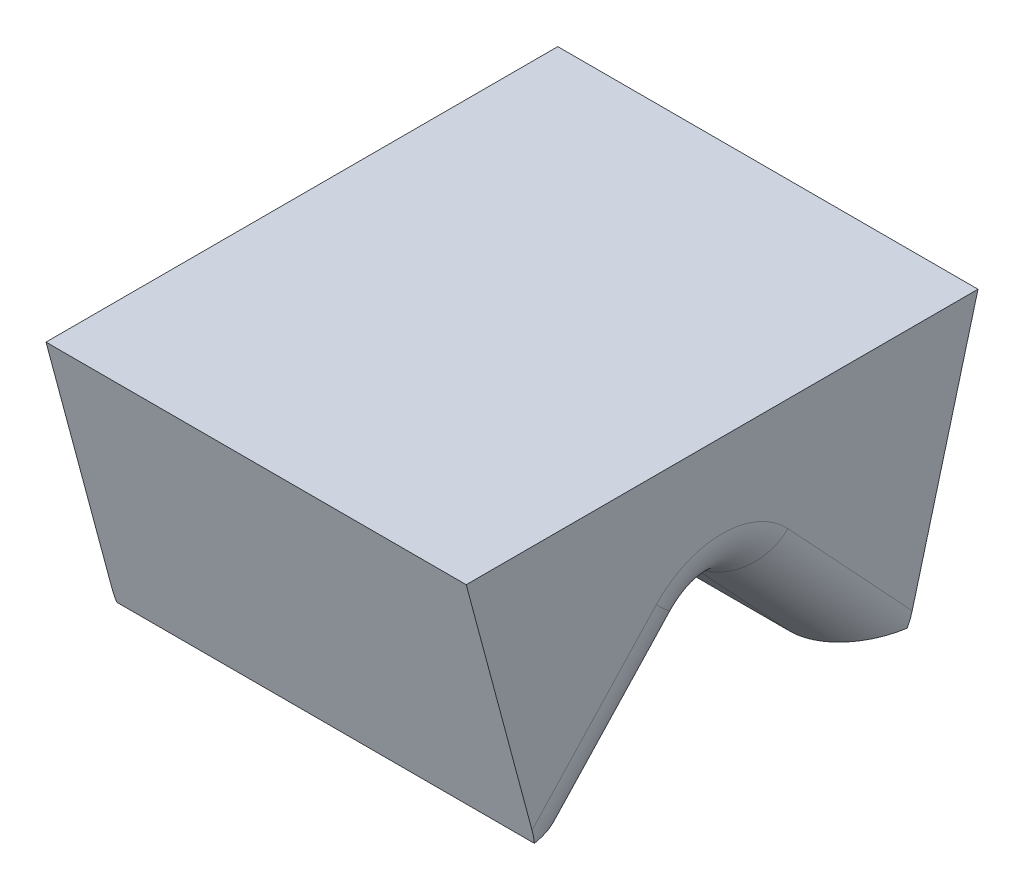
ISO-10303-21;
HEADER;
FILE_DESCRIPTION(('STEP AP214'),'2;1');
FILE_NAME('part.step','',(''),(''),'','','');
FILE_SCHEMA(('AUTOMOTIVE_DESIGN { 1 0 10303 214 1 1 1 1 }'));
ENDSEC;
DATA;
#1=APPLICATION_CONTEXT('core data for automotive mechanical design processes');
#2=APPLICATION_PROTOCOL_DEFINITION('international standard','automotive_design',2000,#1);
#3=PRODUCT_CONTEXT('',#1,'mechanical');
#4=PRODUCT('Part','Part','',(#3));
#5=PRODUCT_RELATED_PRODUCT_CATEGORY('part','',(#4));
#6=PRODUCT_DEFINITION_FORMATION('','',#4);
#7=PRODUCT_DEFINITION_CONTEXT('part definition',#1,'design');
#8=PRODUCT_DEFINITION('design','',#6,#7);
#9=PRODUCT_DEFINITION_SHAPE('','',#8);
#10=(LENGTH_UNIT() NAMED_UNIT(*) SI_UNIT(.MILLI.,.METRE.));
#11=(NAMED_UNIT(*) PLANE_ANGLE_UNIT() SI_UNIT($,.RADIAN.));
#12=(NAMED_UNIT(*) SI_UNIT($,.STERADIAN.) SOLID_ANGLE_UNIT());
#13=UNCERTAINTY_MEASURE_WITH_UNIT(LENGTH_MEASURE(1.E-05),#10,'distance_accuracy_value','');
#14=(GEOMETRIC_REPRESENTATION_CONTEXT(3) GLOBAL_UNCERTAINTY_ASSIGNED_CONTEXT((#13)) GLOBAL_UNIT_ASSIGNED_CONTEXT((#10,
#11,#12)) REPRESENTATION_CONTEXT('',''));
#15=CARTESIAN_POINT('',(0.,0.,0.));
#16=DIRECTION('',(0.,0.,1.));
#17=DIRECTION('',(1.,0.,0.));
#18=AXIS2_PLACEMENT_3D('',#15,#16,#17);
#19=CARTESIAN_POINT('',(0.,0.277595628415304,0.));
#20=DIRECTION('',(0.,1.,0.));
#21=DIRECTION('',(0.,0.,1.));
#22=AXIS2_PLACEMENT_3D('',#19,#20,#21);
#23=PLANE('',#22);
#24=DIRECTION('',(0.,0.,-1.));
#25=VECTOR('',#24,1.);
#26=CARTESIAN_POINT('',(-0.22606,0.277595628415304,1.50859998));
#27=LINE('',#26,#25);
#28=CARTESIAN_POINT('',(-0.22606,0.277595628415304,0.273771524456291));
#29=VERTEX_POINT('',#28);
#30=CARTESIAN_POINT('',(-0.22606,0.277595628415304,-0.273771524456291));
#31=VERTEX_POINT('',#30);
#32=EDGE_CURVE('E142',#29,#31,#27,.T.);
#33=ORIENTED_EDGE('',*,*,#32,.F.);
#34=DIRECTION('',(-1.,0.,0.));
#35=VECTOR('',#34,1.);
#36=CARTESIAN_POINT('',(1.50859998,0.277595628415304,0.273771524456291));
#37=LINE('',#36,#35);
#38=CARTESIAN_POINT('',(0.22352,0.277595628415304,0.273771524456291));
#39=VERTEX_POINT('',#38);
#40=EDGE_CURVE('E57',#39,#29,#37,.T.);
#41=ORIENTED_EDGE('',*,*,#40,.F.);
#42=DIRECTION('',(0.,0.,1.));
#43=VECTOR('',#42,1.);
#44=CARTESIAN_POINT('',(0.22352,0.277595628415304,1.50859998));
#45=LINE('',#44,#43);
#46=CARTESIAN_POINT('',(0.22352,0.277595628415304,-0.273771524456291));
#47=VERTEX_POINT('',#46);
#48=EDGE_CURVE('E12',#47,#39,#45,.T.);
#49=ORIENTED_EDGE('',*,*,#48,.F.);
#50=DIRECTION('',(1.,0.,0.));
#51=VECTOR('',#50,1.);
#52=CARTESIAN_POINT('',(1.50859998,0.277595628415304,-0.273771524456291));
#53=LINE('',#52,#51);
#54=EDGE_CURVE('E129',#31,#47,#53,.T.);
#55=ORIENTED_EDGE('',*,*,#54,.F.);
#56=EDGE_LOOP('',(#33,#41,#49,#55));
#57=FACE_BOUND('',#56,.T.);
#58=ADVANCED_FACE('F42',(#57),#23,.T.);
#59=CARTESIAN_POINT('',(1.50859998,0.,-0.19939));
#60=DIRECTION('',(0.,-0.258819045102522,-0.965925826289068));
#61=DIRECTION('',(0.,0.965925826289068,-0.258819045102522));
#62=AXIS2_PLACEMENT_3D('',#59,#60,#61);
#63=PLANE('',#62);
#64=DIRECTION('',(0.,0.965925826289068,-0.258819045102522));
#65=VECTOR('',#64,1.);
#66=CARTESIAN_POINT('',(-0.22606,0.,-0.19939));
#67=LINE('',#66,#65);
#68=CARTESIAN_POINT('',(-0.22606,0.0148722676221145,-0.203375012098965));
#69=VERTEX_POINT('',#68);
#70=EDGE_CURVE('E141',#69,#31,#67,.T.);
#71=ORIENTED_EDGE('',*,*,#70,.T.);
#72=ORIENTED_EDGE('',*,*,#54,.T.);
#73=DIRECTION('',(0.,-0.965925826289068,0.258819045102522));
#74=VECTOR('',#73,1.);
#75=CARTESIAN_POINT('',(0.22352,0.,-0.19939));
#76=LINE('',#75,#74);
#77=CARTESIAN_POINT('',(0.22352,0.0148722676221145,-0.203375012098965));
#78=VERTEX_POINT('',#77);
#79=EDGE_CURVE('E138',#47,#78,#76,.T.);
#80=ORIENTED_EDGE('',*,*,#79,.T.);
#81=CARTESIAN_POINT('',(0.16256,0.0148722676221145,-0.203375012098965));
#82=DIRECTION('',(0.,-0.258819045102522,-0.965925826289068));
#83=DIRECTION('',(0.,-0.965925826289068,0.258819045102522));
#84=AXIS2_PLACEMENT_3D('',#81,#82,#83);
#85=ELLIPSE('',#84,0.0718827154689534,0.06096);
#86=CARTESIAN_POINT('',(0.222105177071707,0.,-0.19939));
#87=VERTEX_POINT('',#86);
#88=EDGE_CURVE('E251',#78,#87,#85,.T.);
#89=ORIENTED_EDGE('',*,*,#88,.T.);
#90=DIRECTION('',(-1.,0.,0.));
#91=VECTOR('',#90,1.);
#92=CARTESIAN_POINT('',(1.50859998,0.,-0.19939));
#93=LINE('',#92,#91);
#94=CARTESIAN_POINT('',(-0.224645177071708,0.,-0.19939));
#95=VERTEX_POINT('',#94);
#96=EDGE_CURVE('E157',#87,#95,#93,.T.);
#97=ORIENTED_EDGE('',*,*,#96,.T.);
#98=CARTESIAN_POINT('',(-0.1651,0.0148722676221145,-0.203375012098965));
#99=DIRECTION('',(0.,-0.258819045102522,-0.965925826289068));
#100=DIRECTION('',(0.,0.965925826289068,-0.258819045102522));
#101=AXIS2_PLACEMENT_3D('',#98,#99,#100);
#102=ELLIPSE('',#101,0.0718827154689534,0.06096);
#103=EDGE_CURVE('E285',#95,#69,#102,.T.);
#104=ORIENTED_EDGE('',*,*,#103,.T.);
#105=EDGE_LOOP('',(#71,#72,#80,#89,#97,#104));
#106=FACE_BOUND('',#105,.T.);
#107=ADVANCED_FACE('F137',(#106),#63,.T.);
#108=CARTESIAN_POINT('',(1.50859998,0.,0.19939));
#109=DIRECTION('',(0.,-0.258819045102522,0.965925826289068));
#110=DIRECTION('',(0.,-0.965925826289068,-0.258819045102522));
#111=AXIS2_PLACEMENT_3D('',#108,#109,#110);
#112=PLANE('',#111);
#113=DIRECTION('',(0.,0.965925826289068,0.258819045102522));
#114=VECTOR('',#113,1.);
#115=CARTESIAN_POINT('',(0.22352,0.,0.19939));
#116=LINE('',#115,#114);
#117=CARTESIAN_POINT('',(0.22352,0.0148722676221144,0.203375012098965));
#118=VERTEX_POINT('',#117);
#119=EDGE_CURVE('E148',#118,#39,#116,.T.);
#120=ORIENTED_EDGE('',*,*,#119,.T.);
#121=ORIENTED_EDGE('',*,*,#40,.T.);
#122=DIRECTION('',(0.,-0.965925826289068,-0.258819045102522));
#123=VECTOR('',#122,1.);
#124=CARTESIAN_POINT('',(-0.22606,0.,0.19939));
#125=LINE('',#124,#123);
#126=CARTESIAN_POINT('',(-0.22606,0.0148722676221144,0.203375012098965));
#127=VERTEX_POINT('',#126);
#128=EDGE_CURVE('E160',#29,#127,#125,.T.);
#129=ORIENTED_EDGE('',*,*,#128,.T.);
#130=CARTESIAN_POINT('',(-0.1651,0.0148722676221144,0.203375012098965));
#131=DIRECTION('',(0.,-0.258819045102522,0.965925826289068));
#132=DIRECTION('',(0.,-0.965925826289068,-0.258819045102522));
#133=AXIS2_PLACEMENT_3D('',#130,#131,#132);
#134=ELLIPSE('',#133,0.0718827154689534,0.06096);
#135=CARTESIAN_POINT('',(-0.224645177071708,0.,0.19939));
#136=VERTEX_POINT('',#135);
#137=EDGE_CURVE('E64',#127,#136,#134,.T.);
#138=ORIENTED_EDGE('',*,*,#137,.T.);
#139=DIRECTION('',(-1.,0.,0.));
#140=VECTOR('',#139,1.);
#141=CARTESIAN_POINT('',(1.50859998,0.,0.19939));
#142=LINE('',#141,#140);
#143=CARTESIAN_POINT('',(0.222105177071707,0.,0.19939));
#144=VERTEX_POINT('',#143);
#145=EDGE_CURVE('E150',#144,#136,#142,.T.);
#146=ORIENTED_EDGE('',*,*,#145,.F.);
#147=CARTESIAN_POINT('',(0.16256,0.0148722676221144,0.203375012098965));
#148=DIRECTION('',(0.,-0.258819045102522,0.965925826289068));
#149=DIRECTION('',(0.,0.965925826289068,0.258819045102522));
#150=AXIS2_PLACEMENT_3D('',#147,#148,#149);
#151=ELLIPSE('',#150,0.0718827154689534,0.06096);
#152=EDGE_CURVE('E267',#144,#118,#151,.T.);
#153=ORIENTED_EDGE('',*,*,#152,.T.);
#154=EDGE_LOOP('',(#120,#121,#129,#138,#146,#153));
#155=FACE_BOUND('',#154,.T.);
#156=ADVANCED_FACE('F215',(#155),#112,.T.);
#157=CARTESIAN_POINT('',(-0.22606,0.79010002,1.50859998));
#158=DIRECTION('',(-1.,0.,0.));
#159=DIRECTION('',(0.,-1.,0.));
#160=AXIS2_PLACEMENT_3D('',#157,#158,#159);
#161=PLANE('',#160);
#162=ORIENTED_EDGE('',*,*,#128,.F.);
#163=ORIENTED_EDGE('',*,*,#32,.T.);
#164=ORIENTED_EDGE('',*,*,#70,.F.);
#165=DIRECTION('',(0.,-0.731353701619171,-0.681998360062498));
#166=VECTOR('',#165,1.);
#167=CARTESIAN_POINT('',(-0.22606,0.157266481713232,-0.0705902592802821));
#168=LINE('',#167,#166);
#169=CARTESIAN_POINT('',(-0.22606,0.157266481713232,-0.0705902592802823));
#170=VERTEX_POINT('',#169);
#171=EDGE_CURVE('E294',#69,#170,#168,.F.);
#172=ORIENTED_EDGE('',*,*,#171,.T.);
#173=CARTESIAN_POINT('',(-0.22606,0.0914399999999999,0.));
#174=DIRECTION('',(-1.,0.,0.));
#175=DIRECTION('',(0.,-1.,0.));
#176=AXIS2_PLACEMENT_3D('',#173,#174,#175);
#177=CIRCLE('',#176,0.0965199999999998);
#178=CARTESIAN_POINT('',(-0.22606,0.157266481713232,0.0705902592802822));
#179=VERTEX_POINT('',#178);
#180=EDGE_CURVE('E292',#170,#179,#177,.F.);
#181=ORIENTED_EDGE('',*,*,#180,.T.);
#182=DIRECTION('',(0.,0.731353701619172,-0.681998360062497));
#183=VECTOR('',#182,1.);
#184=CARTESIAN_POINT('',(-0.22606,0.0415746200294097,0.178474665643798));
#185=LINE('',#184,#183);
#186=EDGE_CURVE('E289',#179,#127,#185,.F.);
#187=ORIENTED_EDGE('',*,*,#186,.T.);
#188=EDGE_LOOP('',(#162,#163,#164,#172,#181,#187));
#189=FACE_BOUND('',#188,.T.);
#190=ADVANCED_FACE('F320',(#189),#161,.T.);
#191=CARTESIAN_POINT('',(0.22352,-0.00999998,1.50859998));
#192=DIRECTION('',(1.,0.,0.));
#193=DIRECTION('',(0.,1.,0.));
#194=AXIS2_PLACEMENT_3D('',#191,#192,#193);
#195=PLANE('',#194);
#196=ORIENTED_EDGE('',*,*,#79,.F.);
#197=ORIENTED_EDGE('',*,*,#48,.T.);
#198=ORIENTED_EDGE('',*,*,#119,.F.);
#199=DIRECTION('',(0.,-0.731353701619172,0.681998360062497));
#200=VECTOR('',#199,1.);
#201=CARTESIAN_POINT('',(0.22352,0.157266481713232,0.0705902592802824));
#202=LINE('',#201,#200);
#203=CARTESIAN_POINT('',(0.22352,0.157266481713232,0.0705902592802822));
#204=VERTEX_POINT('',#203);
#205=EDGE_CURVE('E244',#118,#204,#202,.F.);
#206=ORIENTED_EDGE('',*,*,#205,.T.);
#207=CARTESIAN_POINT('',(0.22352,0.0914399999999999,0.));
#208=DIRECTION('',(1.,0.,0.));
#209=DIRECTION('',(0.,1.,0.));
#210=AXIS2_PLACEMENT_3D('',#207,#208,#209);
#211=CIRCLE('',#210,0.0965199999999998);
#212=CARTESIAN_POINT('',(0.22352,0.157266481713232,-0.0705902592802823));
#213=VERTEX_POINT('',#212);
#214=EDGE_CURVE('E248',#204,#213,#211,.F.);
#215=ORIENTED_EDGE('',*,*,#214,.T.);
#216=DIRECTION('',(0.,0.731353701619171,0.681998360062498));
#217=VECTOR('',#216,1.);
#218=CARTESIAN_POINT('',(0.22352,0.0415746200294098,-0.178474665643798));
#219=LINE('',#218,#217);
#220=EDGE_CURVE('E146',#213,#78,#219,.F.);
#221=ORIENTED_EDGE('',*,*,#220,.T.);
#222=EDGE_LOOP('',(#196,#197,#198,#206,#215,#221));
#223=FACE_BOUND('',#222,.T.);
#224=ADVANCED_FACE('F144',(#223),#195,.T.);
#225=CARTESIAN_POINT('',(0.,0.,0.));
#226=DIRECTION('',(0.,1.,0.));
#227=DIRECTION('',(0.,0.,1.));
#228=AXIS2_PLACEMENT_3D('',#225,#226,#227);
#229=PLANE('',#228);
#230=CARTESIAN_POINT('',(0.16256,0.,-0.133891343993093));
#231=DIRECTION('',(-1.,0.,0.));
#232=VECTOR('',#231,1.);
#233=LINE('',#230,#232);
#234=CARTESIAN_POINT('',(0.16256,0.,-0.133891343993093));
#235=VERTEX_POINT('',#234);
#236=CARTESIAN_POINT('',(-0.1651,0.,-0.133891343993093));
#237=VERTEX_POINT('',#236);
#238=EDGE_CURVE('E240',#235,#237,#233,.T.);
#239=ORIENTED_EDGE('',*,*,#238,.T.);
#240=CARTESIAN_POINT('',(-0.1651,0.,-0.217243626021663));
#241=DIRECTION('',(0.,1.,0.));
#242=DIRECTION('',(0.,0.,1.));
#243=AXIS2_PLACEMENT_3D('',#240,#241,#242);
#244=ELLIPSE('',#243,0.0833522820285703,0.06096);
#245=EDGE_CURVE('E281',#237,#95,#244,.F.);
#246=ORIENTED_EDGE('',*,*,#245,.T.);
#247=ORIENTED_EDGE('',*,*,#96,.F.);
#248=CARTESIAN_POINT('',(0.16256,0.,-0.217243626021663));
#249=DIRECTION('',(0.,1.,0.));
#250=DIRECTION('',(0.,0.,-1.));
#251=AXIS2_PLACEMENT_3D('',#248,#249,#250);
#252=ELLIPSE('',#251,0.0833522820285703,0.06096);
#253=EDGE_CURVE('E253',#87,#235,#252,.F.);
#254=ORIENTED_EDGE('',*,*,#253,.T.);
#255=EDGE_LOOP('',(#239,#246,#247,#254));
#256=FACE_BOUND('',#255,.T.);
#257=ADVANCED_FACE('F182',(#256),#229,.F.);
#258=ORIENTED_EDGE('',*,*,#145,.T.);
#259=CARTESIAN_POINT('',(-0.1651,0.,0.217243626021663));
#260=DIRECTION('',(0.,1.,0.));
#261=DIRECTION('',(0.,0.,1.));
#262=AXIS2_PLACEMENT_3D('',#259,#260,#261);
#263=ELLIPSE('',#262,0.0833522820285702,0.06096);
#264=CARTESIAN_POINT('',(-0.1651,0.,0.133891343993093));
#265=VERTEX_POINT('',#264);
#266=EDGE_CURVE('E50',#136,#265,#263,.F.);
#267=ORIENTED_EDGE('',*,*,#266,.T.);
#268=CARTESIAN_POINT('',(-0.1651,0.,0.133891343993093));
#269=DIRECTION('',(1.,0.,0.));
#270=VECTOR('',#269,1.);
#271=LINE('',#268,#270);
#272=CARTESIAN_POINT('',(0.16256,0.,0.133891343993093));
#273=VERTEX_POINT('',#272);
#274=EDGE_CURVE('E162',#265,#273,#271,.T.);
#275=ORIENTED_EDGE('',*,*,#274,.T.);
#276=CARTESIAN_POINT('',(0.16256,0.,0.217243626021663));
#277=DIRECTION('',(0.,1.,0.));
#278=DIRECTION('',(0.,0.,-1.));
#279=AXIS2_PLACEMENT_3D('',#276,#277,#278);
#280=ELLIPSE('',#279,0.0833522820285702,0.06096);
#281=EDGE_CURVE('E263',#273,#144,#280,.F.);
#282=ORIENTED_EDGE('',*,*,#281,.T.);
#283=EDGE_LOOP('',(#258,#267,#275,#282));
#284=FACE_BOUND('',#283,.T.);
#285=ADVANCED_FACE('F171',(#284),#229,.F.);
#286=CARTESIAN_POINT('',(-1.20142,0.115691861683822,-0.0260069376295776));
#287=DIRECTION('',(0.,0.681998360062498,-0.731353701619171));
#288=DIRECTION('',(0.,0.731353701619171,0.681998360062498));
#289=AXIS2_PLACEMENT_3D('',#286,#287,#288);
#290=PLANE('',#289);
#291=DIRECTION('',(1.,0.,0.));
#292=VECTOR('',#291,1.);
#293=CARTESIAN_POINT('',(-1.20142,0.115691861683822,-0.0260069376295776));
#294=LINE('',#293,#292);
#295=CARTESIAN_POINT('',(-0.1651,0.115691861683822,-0.0260069376295776));
#296=VERTEX_POINT('',#295);
#297=CARTESIAN_POINT('',(0.16256,0.115691861683822,-0.0260069376295776));
#298=VERTEX_POINT('',#297);
#299=EDGE_CURVE('E279',#296,#298,#294,.T.);
#300=ORIENTED_EDGE('',*,*,#299,.F.);
#301=DIRECTION('',(0.,-0.731353701619171,-0.681998360062498));
#302=VECTOR('',#301,1.);
#303=CARTESIAN_POINT('',(-0.1651,0.,-0.133891343993093));
#304=LINE('',#303,#302);
#305=EDGE_CURVE('E271',#296,#237,#304,.T.);
#306=ORIENTED_EDGE('',*,*,#305,.T.);
#307=ORIENTED_EDGE('',*,*,#238,.F.);
#308=DIRECTION('',(0.,0.731353701619171,0.681998360062498));
#309=VECTOR('',#308,1.);
#310=CARTESIAN_POINT('',(0.16256,0.115691861683822,-0.0260069376295776));
#311=LINE('',#310,#309);
#312=EDGE_CURVE('E242',#235,#298,#311,.T.);
#313=ORIENTED_EDGE('',*,*,#312,.T.);
#314=EDGE_LOOP('',(#300,#306,#307,#313));
#315=FACE_BOUND('',#314,.T.);
#316=ADVANCED_FACE('F181',(#315),#290,.F.);
#317=CARTESIAN_POINT('',(-1.20142,-0.00999998000000011,0.143216476204168));
#318=DIRECTION('',(0.,0.681998360062497,0.731353701619172));
#319=DIRECTION('',(0.,-0.731353701619172,0.681998360062497));
#320=AXIS2_PLACEMENT_3D('',#317,#318,#319);
#321=PLANE('',#320);
#322=ORIENTED_EDGE('',*,*,#274,.F.);
#323=DIRECTION('',(0.,0.731353701619172,-0.681998360062497));
#324=VECTOR('',#323,1.);
#325=CARTESIAN_POINT('',(-0.1651,0.115691861683822,0.0260069376295777));
#326=LINE('',#325,#324);
#327=CARTESIAN_POINT('',(-0.1651,0.115691861683822,0.0260069376295776));
#328=VERTEX_POINT('',#327);
#329=EDGE_CURVE('E297',#265,#328,#326,.T.);
#330=ORIENTED_EDGE('',*,*,#329,.T.);
#331=DIRECTION('',(1.,0.,0.));
#332=VECTOR('',#331,1.);
#333=CARTESIAN_POINT('',(-1.20142,0.115691861683822,0.0260069376295776));
#334=LINE('',#333,#332);
#335=CARTESIAN_POINT('',(0.16256,0.115691861683822,0.0260069376295776));
#336=VERTEX_POINT('',#335);
#337=EDGE_CURVE('E152',#328,#336,#334,.T.);
#338=ORIENTED_EDGE('',*,*,#337,.T.);
#339=DIRECTION('',(0.,-0.731353701619172,0.681998360062497));
#340=VECTOR('',#339,1.);
#341=CARTESIAN_POINT('',(0.16256,0.,0.133891343993093));
#342=LINE('',#341,#340);
#343=EDGE_CURVE('E260',#336,#273,#342,.T.);
#344=ORIENTED_EDGE('',*,*,#343,.T.);
#345=EDGE_LOOP('',(#322,#330,#338,#344));
#346=FACE_BOUND('',#345,.T.);
#347=ADVANCED_FACE('F220',(#346),#321,.F.);
#348=CARTESIAN_POINT('',(-1.20142,0.0914399999999999,0.));
#349=DIRECTION('',(1.,0.,0.));
#350=DIRECTION('',(0.,0.,-1.));
#351=AXIS2_PLACEMENT_3D('',#348,#349,#350);
#352=CYLINDRICAL_SURFACE('',#351,0.0355599999999998);
#353=ORIENTED_EDGE('',*,*,#337,.F.);
#354=CARTESIAN_POINT('',(-0.1651,0.0914399999999999,0.));
#355=DIRECTION('',(-1.,0.,0.));
#356=DIRECTION('',(0.,-1.,0.));
#357=AXIS2_PLACEMENT_3D('',#354,#355,#356);
#358=CIRCLE('',#357,0.0355599999999998);
#359=EDGE_CURVE('E296',#328,#296,#358,.T.);
#360=ORIENTED_EDGE('',*,*,#359,.T.);
#361=ORIENTED_EDGE('',*,*,#299,.T.);
#362=CARTESIAN_POINT('',(0.16256,0.0914399999999999,0.));
#363=DIRECTION('',(1.,0.,0.));
#364=DIRECTION('',(0.,1.,0.));
#365=AXIS2_PLACEMENT_3D('',#362,#363,#364);
#366=CIRCLE('',#365,0.0355599999999998);
#367=EDGE_CURVE('E255',#298,#336,#366,.T.);
#368=ORIENTED_EDGE('',*,*,#367,.T.);
#369=EDGE_LOOP('',(#353,#360,#361,#368));
#370=FACE_BOUND('',#369,.T.);
#371=ADVANCED_FACE('F197',(#370),#352,.F.);
#372=CARTESIAN_POINT('',(0.16256,0.0315746400294098,0.187799797854873));
#373=DIRECTION('',(0.,0.731353701619172,-0.681998360062497));
#374=DIRECTION('',(0.,0.681998360062497,0.731353701619172));
#375=AXIS2_PLACEMENT_3D('',#372,#373,#374);
#376=CYLINDRICAL_SURFACE('',#375,0.06096);
#377=ORIENTED_EDGE('',*,*,#281,.F.);
#378=ORIENTED_EDGE('',*,*,#343,.F.);
#379=CARTESIAN_POINT('',(0.16256,0.157266481713232,0.0705902592802822));
#380=DIRECTION('',(0.,0.731353701619171,-0.681998360062498));
#381=DIRECTION('',(0.,0.681998360062498,0.731353701619171));
#382=AXIS2_PLACEMENT_3D('',#379,#380,#381);
#383=CIRCLE('',#382,0.06096);
#384=EDGE_CURVE('E275',#204,#336,#383,.T.);
#385=ORIENTED_EDGE('',*,*,#384,.F.);
#386=ORIENTED_EDGE('',*,*,#205,.F.);
#387=ORIENTED_EDGE('',*,*,#152,.F.);
#388=EDGE_LOOP('',(#377,#378,#385,#386,#387));
#389=FACE_BOUND('',#388,.T.);
#390=ADVANCED_FACE('F193',(#389),#376,.T.);
#391=CARTESIAN_POINT('',(0.16256,0.0914399999999999,0.));
#392=DIRECTION('',(1.,0.,0.));
#393=DIRECTION('',(0.,1.,0.));
#394=AXIS2_PLACEMENT_3D('',#391,#392,#393);
#395=TOROIDAL_SURFACE('',#394,0.0965199999999998,0.06096);
#396=ORIENTED_EDGE('',*,*,#384,.T.);
#397=ORIENTED_EDGE('',*,*,#367,.F.);
#398=CARTESIAN_POINT('',(0.16256,0.157266481713232,-0.0705902592802823));
#399=DIRECTION('',(0.,-0.731353701619171,-0.681998360062498));
#400=DIRECTION('',(0.,0.681998360062498,-0.731353701619171));
#401=AXIS2_PLACEMENT_3D('',#398,#399,#400);
#402=CIRCLE('',#401,0.06096);
#403=EDGE_CURVE('E272',#213,#298,#402,.T.);
#404=ORIENTED_EDGE('',*,*,#403,.F.);
#405=ORIENTED_EDGE('',*,*,#214,.F.);
#406=EDGE_LOOP('',(#396,#397,#404,#405));
#407=FACE_BOUND('',#406,.T.);
#408=ADVANCED_FACE('F189',(#407),#395,.T.);
#409=CARTESIAN_POINT('',(0.16256,0.157266481713232,-0.0705902592802822));
#410=DIRECTION('',(0.,-0.731353701619171,-0.681998360062498));
#411=DIRECTION('',(0.,0.681998360062498,-0.731353701619171));
#412=AXIS2_PLACEMENT_3D('',#409,#410,#411);
#413=CYLINDRICAL_SURFACE('',#412,0.06096);
#414=ORIENTED_EDGE('',*,*,#88,.F.);
#415=ORIENTED_EDGE('',*,*,#220,.F.);
#416=ORIENTED_EDGE('',*,*,#403,.T.);
#417=ORIENTED_EDGE('',*,*,#312,.F.);
#418=ORIENTED_EDGE('',*,*,#253,.F.);
#419=EDGE_LOOP('',(#414,#415,#416,#417,#418));
#420=FACE_BOUND('',#419,.T.);
#421=ADVANCED_FACE('F185',(#420),#413,.T.);
#422=CARTESIAN_POINT('',(-0.1651,0.0315746400294098,0.187799797854873));
#423=DIRECTION('',(0.,-0.731353701619172,0.681998360062497));
#424=DIRECTION('',(0.,-0.681998360062497,-0.731353701619172));
#425=AXIS2_PLACEMENT_3D('',#422,#423,#424);
#426=CYLINDRICAL_SURFACE('',#425,0.06096);
#427=ORIENTED_EDGE('',*,*,#137,.F.);
#428=ORIENTED_EDGE('',*,*,#186,.F.);
#429=CARTESIAN_POINT('',(-0.1651,0.157266481713232,0.0705902592802823));
#430=DIRECTION('',(0.,0.731353701619171,-0.681998360062497));
#431=DIRECTION('',(0.,0.681998360062497,0.731353701619171));
#432=AXIS2_PLACEMENT_3D('',#429,#430,#431);
#433=CIRCLE('',#432,0.06096);
#434=EDGE_CURVE('E276',#328,#179,#433,.T.);
#435=ORIENTED_EDGE('',*,*,#434,.F.);
#436=ORIENTED_EDGE('',*,*,#329,.F.);
#437=ORIENTED_EDGE('',*,*,#266,.F.);
#438=EDGE_LOOP('',(#427,#428,#435,#436,#437));
#439=FACE_BOUND('',#438,.T.);
#440=ADVANCED_FACE('F44',(#439),#426,.T.);
#441=CARTESIAN_POINT('',(-0.1651,0.0914399999999999,0.));
#442=DIRECTION('',(-1.,0.,0.));
#443=DIRECTION('',(0.,-1.,0.));
#444=AXIS2_PLACEMENT_3D('',#441,#442,#443);
#445=TOROIDAL_SURFACE('',#444,0.0965199999999998,0.06096);
#446=ORIENTED_EDGE('',*,*,#434,.T.);
#447=ORIENTED_EDGE('',*,*,#180,.F.);
#448=CARTESIAN_POINT('',(-0.1651,0.157266481713232,-0.0705902592802822));
#449=DIRECTION('',(0.,-0.731353701619171,-0.681998360062498));
#450=DIRECTION('',(0.,0.681998360062498,-0.731353701619171));
#451=AXIS2_PLACEMENT_3D('',#448,#449,#450);
#452=CIRCLE('',#451,0.06096);
#453=EDGE_CURVE('E310',#296,#170,#452,.T.);
#454=ORIENTED_EDGE('',*,*,#453,.F.);
#455=ORIENTED_EDGE('',*,*,#359,.F.);
#456=EDGE_LOOP('',(#446,#447,#454,#455));
#457=FACE_BOUND('',#456,.T.);
#458=ADVANCED_FACE('F201',(#457),#445,.T.);
#459=CARTESIAN_POINT('',(-0.1651,0.157266481713232,-0.0705902592802822));
#460=DIRECTION('',(0.,0.731353701619171,0.681998360062498));
#461=DIRECTION('',(0.,-0.681998360062498,0.731353701619171));
#462=AXIS2_PLACEMENT_3D('',#459,#460,#461);
#463=CYLINDRICAL_SURFACE('',#462,0.06096);
#464=ORIENTED_EDGE('',*,*,#453,.T.);
#465=ORIENTED_EDGE('',*,*,#171,.F.);
#466=ORIENTED_EDGE('',*,*,#103,.F.);
#467=ORIENTED_EDGE('',*,*,#245,.F.);
#468=ORIENTED_EDGE('',*,*,#305,.F.);
#469=EDGE_LOOP('',(#464,#465,#466,#467,#468));
#470=FACE_BOUND('',#469,.T.);
#471=ADVANCED_FACE('F199',(#470),#463,.T.);
#472=CLOSED_SHELL('',(#58,#107,#156,#190,#224,#257,#285,#316,#347,#371,#390,#408,#421,#440,#458,#471));
#473=MANIFOLD_SOLID_BREP('B2',#472);
#474=ADVANCED_BREP_SHAPE_REPRESENTATION('',(#18,#473),#14);
#475=SHAPE_DEFINITION_REPRESENTATION(#9,#474);
ENDSEC;
END-ISO-10303-21;
